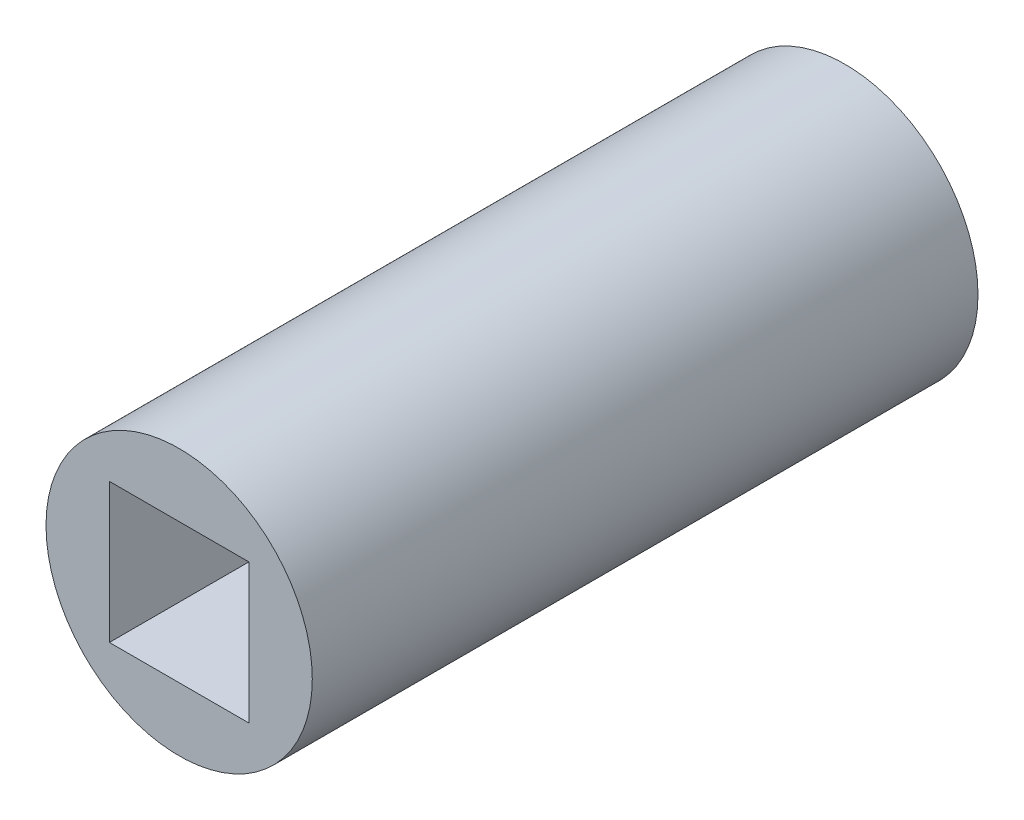
ISO-10303-21;
HEADER;
FILE_DESCRIPTION(('STEP AP214'),'2;1');
FILE_NAME('part.step','',(''),(''),'','','');
FILE_SCHEMA(('AUTOMOTIVE_DESIGN { 1 0 10303 214 1 1 1 1 }'));
ENDSEC;
DATA;
#1=APPLICATION_CONTEXT('core data for automotive mechanical design processes');
#2=APPLICATION_PROTOCOL_DEFINITION('international standard','automotive_design',2000,#1);
#3=PRODUCT_CONTEXT('',#1,'mechanical');
#4=PRODUCT('Part','Part','',(#3));
#5=PRODUCT_RELATED_PRODUCT_CATEGORY('part','',(#4));
#6=PRODUCT_DEFINITION_FORMATION('','',#4);
#7=PRODUCT_DEFINITION_CONTEXT('part definition',#1,'design');
#8=PRODUCT_DEFINITION('design','',#6,#7);
#9=PRODUCT_DEFINITION_SHAPE('','',#8);
#10=(LENGTH_UNIT() NAMED_UNIT(*) SI_UNIT(.MILLI.,.METRE.));
#11=(NAMED_UNIT(*) PLANE_ANGLE_UNIT() SI_UNIT($,.RADIAN.));
#12=(NAMED_UNIT(*) SI_UNIT($,.STERADIAN.) SOLID_ANGLE_UNIT());
#13=UNCERTAINTY_MEASURE_WITH_UNIT(LENGTH_MEASURE(1.E-05),#10,'distance_accuracy_value','');
#14=(GEOMETRIC_REPRESENTATION_CONTEXT(3) GLOBAL_UNCERTAINTY_ASSIGNED_CONTEXT((#13)) GLOBAL_UNIT_ASSIGNED_CONTEXT((#10,
#11,#12)) REPRESENTATION_CONTEXT('',''));
#15=CARTESIAN_POINT('',(0.,0.,0.));
#16=DIRECTION('',(0.,0.,1.));
#17=DIRECTION('',(1.,0.,0.));
#18=AXIS2_PLACEMENT_3D('',#15,#16,#17);
#19=CARTESIAN_POINT('',(0.,0.,0.));
#20=DIRECTION('',(0.,0.,-1.));
#21=DIRECTION('',(-1.,0.,0.));
#22=AXIS2_PLACEMENT_3D('',#19,#20,#21);
#23=PLANE('',#22);
#24=CARTESIAN_POINT('',(0.,0.,0.));
#25=DIRECTION('',(0.,0.,1.));
#26=DIRECTION('',(1.,0.,0.));
#27=AXIS2_PLACEMENT_3D('',#24,#25,#26);
#28=CIRCLE('',#27,3.5);
#29=CARTESIAN_POINT('',(3.5,0.,0.));
#30=VERTEX_POINT('',#29);
#31=EDGE_CURVE('E11',#30,#30,#28,.T.);
#32=ORIENTED_EDGE('',*,*,#31,.F.);
#33=EDGE_LOOP('',(#32));
#34=FACE_BOUND('',#33,.T.);
#35=DIRECTION('',(-1.,0.,0.));
#36=VECTOR('',#35,1.);
#37=CARTESIAN_POINT('',(-2.,1.5,0.));
#38=LINE('',#37,#36);
#39=CARTESIAN_POINT('',(2.,1.5,0.));
#40=VERTEX_POINT('',#39);
#41=CARTESIAN_POINT('',(-2.,1.5,0.));
#42=VERTEX_POINT('',#41);
#43=EDGE_CURVE('E136',#40,#42,#38,.T.);
#44=ORIENTED_EDGE('',*,*,#43,.T.);
#45=CARTESIAN_POINT('',(0.,0.,0.));
#46=DIRECTION('',(0.,0.,1.));
#47=DIRECTION('',(1.,0.,0.));
#48=AXIS2_PLACEMENT_3D('',#45,#46,#47);
#49=CIRCLE('',#48,2.5);
#50=EDGE_CURVE('E59',#42,#40,#49,.T.);
#51=ORIENTED_EDGE('',*,*,#50,.T.);
#52=EDGE_LOOP('',(#44,#51));
#53=FACE_BOUND('',#52,.T.);
#54=ADVANCED_FACE('F36',(#34,#53),#23,.T.);
#55=CARTESIAN_POINT('',(0.,0.,10.));
#56=DIRECTION('',(0.,0.,-1.));
#57=DIRECTION('',(-1.,0.,0.));
#58=AXIS2_PLACEMENT_3D('',#55,#56,#57);
#59=CYLINDRICAL_SURFACE('',#58,3.5);
#60=ORIENTED_EDGE('',*,*,#31,.T.);
#61=EDGE_LOOP('',(#60));
#62=FACE_BOUND('',#61,.T.);
#63=CARTESIAN_POINT('',(0.,0.,17.5));
#64=DIRECTION('',(0.,0.,1.));
#65=DIRECTION('',(1.,0.,0.));
#66=AXIS2_PLACEMENT_3D('',#63,#64,#65);
#67=CIRCLE('',#66,3.5);
#68=CARTESIAN_POINT('',(3.5,0.,17.5));
#69=VERTEX_POINT('',#68);
#70=EDGE_CURVE('E126',#69,#69,#67,.T.);
#71=ORIENTED_EDGE('',*,*,#70,.F.);
#72=EDGE_LOOP('',(#71));
#73=FACE_BOUND('',#72,.T.);
#74=ADVANCED_FACE('F38',(#62,#73),#59,.T.);
#75=CARTESIAN_POINT('',(0.,0.,10.));
#76=DIRECTION('',(0.,0.,-1.));
#77=DIRECTION('',(-1.,0.,0.));
#78=AXIS2_PLACEMENT_3D('',#75,#76,#77);
#79=CYLINDRICAL_SURFACE('',#78,2.5);
#80=ORIENTED_EDGE('',*,*,#50,.F.);
#81=DIRECTION('',(0.,0.,-1.));
#82=VECTOR('',#81,1.);
#83=CARTESIAN_POINT('',(-2.,1.5,10.));
#84=LINE('',#83,#82);
#85=CARTESIAN_POINT('',(-2.,1.5,10.));
#86=VERTEX_POINT('',#85);
#87=EDGE_CURVE('E139',#86,#42,#84,.T.);
#88=ORIENTED_EDGE('',*,*,#87,.F.);
#89=CARTESIAN_POINT('',(0.,0.,10.));
#90=DIRECTION('',(0.,0.,1.));
#91=DIRECTION('',(1.,0.,0.));
#92=AXIS2_PLACEMENT_3D('',#89,#90,#91);
#93=CIRCLE('',#92,2.5);
#94=CARTESIAN_POINT('',(2.,1.5,10.));
#95=VERTEX_POINT('',#94);
#96=EDGE_CURVE('E132',#86,#95,#93,.T.);
#97=ORIENTED_EDGE('',*,*,#96,.T.);
#98=DIRECTION('',(0.,0.,-1.));
#99=VECTOR('',#98,1.);
#100=CARTESIAN_POINT('',(2.,1.5,10.));
#101=LINE('',#100,#99);
#102=EDGE_CURVE('E44',#95,#40,#101,.T.);
#103=ORIENTED_EDGE('',*,*,#102,.T.);
#104=EDGE_LOOP('',(#80,#88,#97,#103));
#105=FACE_BOUND('',#104,.T.);
#106=ADVANCED_FACE('F144',(#105),#79,.F.);
#107=CARTESIAN_POINT('',(-2.,1.5,10.));
#108=DIRECTION('',(0.,-1.,0.));
#109=DIRECTION('',(0.,0.,-1.));
#110=AXIS2_PLACEMENT_3D('',#107,#108,#109);
#111=PLANE('',#110);
#112=ORIENTED_EDGE('',*,*,#43,.F.);
#113=ORIENTED_EDGE('',*,*,#102,.F.);
#114=DIRECTION('',(-1.,0.,0.));
#115=VECTOR('',#114,1.);
#116=CARTESIAN_POINT('',(-2.,1.5,10.));
#117=LINE('',#116,#115);
#118=EDGE_CURVE('E135',#95,#86,#117,.T.);
#119=ORIENTED_EDGE('',*,*,#118,.T.);
#120=ORIENTED_EDGE('',*,*,#87,.T.);
#121=EDGE_LOOP('',(#112,#113,#119,#120));
#122=FACE_BOUND('',#121,.T.);
#123=ADVANCED_FACE('F147',(#122),#111,.T.);
#124=CARTESIAN_POINT('',(0.,0.,10.));
#125=DIRECTION('',(0.,0.,1.));
#126=DIRECTION('',(1.,0.,0.));
#127=AXIS2_PLACEMENT_3D('',#124,#125,#126);
#128=PLANE('',#127);
#129=ORIENTED_EDGE('',*,*,#96,.F.);
#130=ORIENTED_EDGE('',*,*,#118,.F.);
#131=EDGE_LOOP('',(#129,#130));
#132=FACE_BOUND('',#131,.T.);
#133=ADVANCED_FACE('F149',(#132),#128,.F.);
#134=CARTESIAN_POINT('',(0.,0.,17.5));
#135=DIRECTION('',(0.,0.,1.));
#136=DIRECTION('',(1.,0.,0.));
#137=AXIS2_PLACEMENT_3D('',#134,#135,#136);
#138=PLANE('',#137);
#139=DIRECTION('',(0.,1.,0.));
#140=VECTOR('',#139,1.);
#141=CARTESIAN_POINT('',(1.833798025,-1.833784525,17.5));
#142=LINE('',#141,#140);
#143=CARTESIAN_POINT('',(1.833798025,-1.833784525,17.5));
#144=VERTEX_POINT('',#143);
#145=CARTESIAN_POINT('',(1.833798025,1.833784525,17.5));
#146=VERTEX_POINT('',#145);
#147=EDGE_CURVE('E51',#144,#146,#142,.T.);
#148=ORIENTED_EDGE('',*,*,#147,.F.);
#149=DIRECTION('',(1.,0.,0.));
#150=VECTOR('',#149,1.);
#151=CARTESIAN_POINT('',(-1.833798025,-1.833784525,17.5));
#152=LINE('',#151,#150);
#153=CARTESIAN_POINT('',(-1.833798025,-1.833784525,17.5));
#154=VERTEX_POINT('',#153);
#155=EDGE_CURVE('E111',#154,#144,#152,.T.);
#156=ORIENTED_EDGE('',*,*,#155,.F.);
#157=DIRECTION('',(0.,-1.,0.));
#158=VECTOR('',#157,1.);
#159=CARTESIAN_POINT('',(-1.833798025,-1.833784525,17.5));
#160=LINE('',#159,#158);
#161=CARTESIAN_POINT('',(-1.833798025,1.833784525,17.5));
#162=VERTEX_POINT('',#161);
#163=EDGE_CURVE('E114',#162,#154,#160,.T.);
#164=ORIENTED_EDGE('',*,*,#163,.F.);
#165=DIRECTION('',(-1.,0.,0.));
#166=VECTOR('',#165,1.);
#167=CARTESIAN_POINT('',(-1.833798025,1.833784525,17.5));
#168=LINE('',#167,#166);
#169=EDGE_CURVE('E120',#146,#162,#168,.T.);
#170=ORIENTED_EDGE('',*,*,#169,.F.);
#171=EDGE_LOOP('',(#148,#156,#164,#170));
#172=FACE_BOUND('',#171,.T.);
#173=ORIENTED_EDGE('',*,*,#70,.T.);
#174=EDGE_LOOP('',(#173));
#175=FACE_BOUND('',#174,.T.);
#176=ADVANCED_FACE('F151',(#172,#175),#138,.T.);
#177=CARTESIAN_POINT('',(1.833798025,-1.833784525,12.5));
#178=DIRECTION('',(1.,0.,0.));
#179=DIRECTION('',(0.,0.,-1.));
#180=AXIS2_PLACEMENT_3D('',#177,#178,#179);
#181=PLANE('',#180);
#182=ORIENTED_EDGE('',*,*,#147,.T.);
#183=DIRECTION('',(0.,0.,1.));
#184=VECTOR('',#183,1.);
#185=CARTESIAN_POINT('',(1.833798025,1.833784525,12.5));
#186=LINE('',#185,#184);
#187=CARTESIAN_POINT('',(1.833798025,1.833784525,12.5));
#188=VERTEX_POINT('',#187);
#189=EDGE_CURVE('E89',#188,#146,#186,.T.);
#190=ORIENTED_EDGE('',*,*,#189,.F.);
#191=DIRECTION('',(0.,1.,0.));
#192=VECTOR('',#191,1.);
#193=CARTESIAN_POINT('',(1.833798025,-1.833784525,12.5));
#194=LINE('',#193,#192);
#195=CARTESIAN_POINT('',(1.833798025,-1.833784525,12.5));
#196=VERTEX_POINT('',#195);
#197=EDGE_CURVE('E93',#196,#188,#194,.T.);
#198=ORIENTED_EDGE('',*,*,#197,.F.);
#199=DIRECTION('',(0.,0.,1.));
#200=VECTOR('',#199,1.);
#201=CARTESIAN_POINT('',(1.833798025,-1.833784525,12.5));
#202=LINE('',#201,#200);
#203=EDGE_CURVE('E124',#196,#144,#202,.T.);
#204=ORIENTED_EDGE('',*,*,#203,.T.);
#205=EDGE_LOOP('',(#182,#190,#198,#204));
#206=FACE_BOUND('',#205,.T.);
#207=ADVANCED_FACE('F91',(#206),#181,.F.);
#208=CARTESIAN_POINT('',(-1.833798025,-1.833784525,12.5));
#209=DIRECTION('',(0.,-1.,0.));
#210=DIRECTION('',(0.,0.,-1.));
#211=AXIS2_PLACEMENT_3D('',#208,#209,#210);
#212=PLANE('',#211);
#213=ORIENTED_EDGE('',*,*,#155,.T.);
#214=ORIENTED_EDGE('',*,*,#203,.F.);
#215=DIRECTION('',(1.,0.,0.));
#216=VECTOR('',#215,1.);
#217=CARTESIAN_POINT('',(-1.833798025,-1.833784525,12.5));
#218=LINE('',#217,#216);
#219=CARTESIAN_POINT('',(-1.833798025,-1.833784525,12.5));
#220=VERTEX_POINT('',#219);
#221=EDGE_CURVE('E99',#220,#196,#218,.T.);
#222=ORIENTED_EDGE('',*,*,#221,.F.);
#223=DIRECTION('',(0.,0.,1.));
#224=VECTOR('',#223,1.);
#225=CARTESIAN_POINT('',(-1.833798025,-1.833784525,12.5));
#226=LINE('',#225,#224);
#227=EDGE_CURVE('E127',#220,#154,#226,.T.);
#228=ORIENTED_EDGE('',*,*,#227,.T.);
#229=EDGE_LOOP('',(#213,#214,#222,#228));
#230=FACE_BOUND('',#229,.T.);
#231=ADVANCED_FACE('F200',(#230),#212,.F.);
#232=CARTESIAN_POINT('',(-1.833798025,-1.833784525,12.5));
#233=DIRECTION('',(-1.,0.,0.));
#234=DIRECTION('',(0.,0.,1.));
#235=AXIS2_PLACEMENT_3D('',#232,#233,#234);
#236=PLANE('',#235);
#237=ORIENTED_EDGE('',*,*,#163,.T.);
#238=ORIENTED_EDGE('',*,*,#227,.F.);
#239=DIRECTION('',(0.,-1.,0.));
#240=VECTOR('',#239,1.);
#241=CARTESIAN_POINT('',(-1.833798025,-1.833784525,12.5));
#242=LINE('',#241,#240);
#243=CARTESIAN_POINT('',(-1.833798025,1.833784525,12.5));
#244=VERTEX_POINT('',#243);
#245=EDGE_CURVE('E107',#244,#220,#242,.T.);
#246=ORIENTED_EDGE('',*,*,#245,.F.);
#247=DIRECTION('',(0.,0.,1.));
#248=VECTOR('',#247,1.);
#249=CARTESIAN_POINT('',(-1.833798025,1.833784525,12.5));
#250=LINE('',#249,#248);
#251=EDGE_CURVE('E98',#244,#162,#250,.T.);
#252=ORIENTED_EDGE('',*,*,#251,.T.);
#253=EDGE_LOOP('',(#237,#238,#246,#252));
#254=FACE_BOUND('',#253,.T.);
#255=ADVANCED_FACE('F210',(#254),#236,.F.);
#256=CARTESIAN_POINT('',(-1.833798025,1.833784525,12.5));
#257=DIRECTION('',(0.,1.,0.));
#258=DIRECTION('',(0.,0.,1.));
#259=AXIS2_PLACEMENT_3D('',#256,#257,#258);
#260=PLANE('',#259);
#261=ORIENTED_EDGE('',*,*,#169,.T.);
#262=ORIENTED_EDGE('',*,*,#251,.F.);
#263=DIRECTION('',(-1.,0.,0.));
#264=VECTOR('',#263,1.);
#265=CARTESIAN_POINT('',(-1.833798025,1.833784525,12.5));
#266=LINE('',#265,#264);
#267=EDGE_CURVE('E102',#188,#244,#266,.T.);
#268=ORIENTED_EDGE('',*,*,#267,.F.);
#269=ORIENTED_EDGE('',*,*,#189,.T.);
#270=EDGE_LOOP('',(#261,#262,#268,#269));
#271=FACE_BOUND('',#270,.T.);
#272=ADVANCED_FACE('F103',(#271),#260,.F.);
#273=CARTESIAN_POINT('',(0.,0.,12.5));
#274=DIRECTION('',(0.,0.,-1.));
#275=DIRECTION('',(-1.,0.,0.));
#276=AXIS2_PLACEMENT_3D('',#273,#274,#275);
#277=PLANE('',#276);
#278=ORIENTED_EDGE('',*,*,#197,.T.);
#279=ORIENTED_EDGE('',*,*,#267,.T.);
#280=ORIENTED_EDGE('',*,*,#245,.T.);
#281=ORIENTED_EDGE('',*,*,#221,.T.);
#282=EDGE_LOOP('',(#278,#279,#280,#281));
#283=FACE_BOUND('',#282,.T.);
#284=ADVANCED_FACE('F109',(#283),#277,.F.);
#285=CLOSED_SHELL('',(#54,#74,#106,#123,#133,#176,#207,#231,#255,#272,#284));
#286=MANIFOLD_SOLID_BREP('B2',#285);
#287=ADVANCED_BREP_SHAPE_REPRESENTATION('',(#18,#286),#14);
#288=SHAPE_DEFINITION_REPRESENTATION(#9,#287);
ENDSEC;
END-ISO-10303-21;
